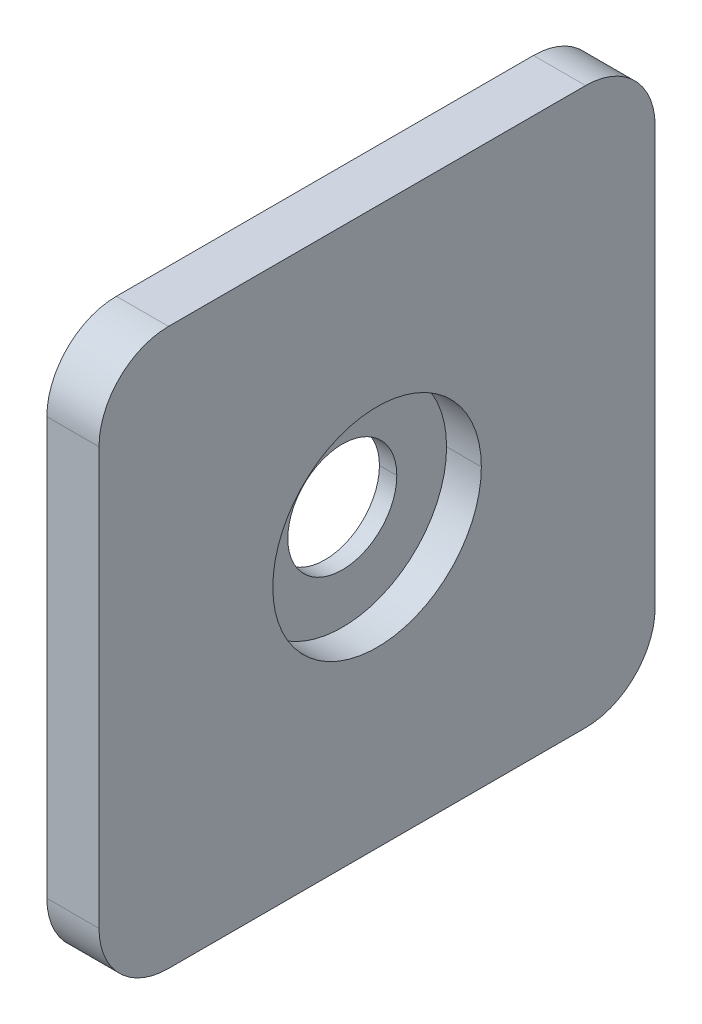
ISO-10303-21;
HEADER;
FILE_DESCRIPTION(('STEP AP214'),'2;1');
FILE_NAME('part.step','',(''),(''),'','','');
FILE_SCHEMA(('AUTOMOTIVE_DESIGN { 1 0 10303 214 1 1 1 1 }'));
ENDSEC;
DATA;
#1=APPLICATION_CONTEXT('core data for automotive mechanical design processes');
#2=APPLICATION_PROTOCOL_DEFINITION('international standard','automotive_design',2000,#1);
#3=PRODUCT_CONTEXT('',#1,'mechanical');
#4=PRODUCT('Part','Part','',(#3));
#5=PRODUCT_RELATED_PRODUCT_CATEGORY('part','',(#4));
#6=PRODUCT_DEFINITION_FORMATION('','',#4);
#7=PRODUCT_DEFINITION_CONTEXT('part definition',#1,'design');
#8=PRODUCT_DEFINITION('design','',#6,#7);
#9=PRODUCT_DEFINITION_SHAPE('','',#8);
#10=(LENGTH_UNIT() NAMED_UNIT(*) SI_UNIT(.MILLI.,.METRE.));
#11=(NAMED_UNIT(*) PLANE_ANGLE_UNIT() SI_UNIT($,.RADIAN.));
#12=(NAMED_UNIT(*) SI_UNIT($,.STERADIAN.) SOLID_ANGLE_UNIT());
#13=UNCERTAINTY_MEASURE_WITH_UNIT(LENGTH_MEASURE(1.E-05),#10,'distance_accuracy_value','');
#14=(GEOMETRIC_REPRESENTATION_CONTEXT(3) GLOBAL_UNCERTAINTY_ASSIGNED_CONTEXT((#13)) GLOBAL_UNIT_ASSIGNED_CONTEXT((#10,
#11,#12)) REPRESENTATION_CONTEXT('',''));
#15=CARTESIAN_POINT('',(0.,0.,0.));
#16=DIRECTION('',(0.,0.,1.));
#17=DIRECTION('',(1.,0.,0.));
#18=AXIS2_PLACEMENT_3D('',#15,#16,#17);
#19=CARTESIAN_POINT('',(-0.396875,0.,0.));
#20=DIRECTION('',(1.,0.,0.));
#21=DIRECTION('',(0.,0.,-1.));
#22=AXIS2_PLACEMENT_3D('',#19,#20,#21);
#23=CYLINDRICAL_SURFACE('',#22,4.7625);
#24=DIRECTION('',(1.,0.,0.));
#25=VECTOR('',#24,1.);
#26=CARTESIAN_POINT('',(-0.396875,0.,4.7625));
#27=LINE('',#26,#25);
#28=CARTESIAN_POINT('',(-0.396875,0.,4.7625));
#29=VERTEX_POINT('',#28);
#30=CARTESIAN_POINT('',(1.190625,0.,4.7625));
#31=VERTEX_POINT('',#30);
#32=EDGE_CURVE('E155',#29,#31,#27,.T.);
#33=ORIENTED_EDGE('',*,*,#32,.F.);
#34=CARTESIAN_POINT('',(-0.396875,0.,0.));
#35=DIRECTION('',(1.,0.,0.));
#36=DIRECTION('',(0.,0.,-1.));
#37=AXIS2_PLACEMENT_3D('',#34,#35,#36);
#38=CIRCLE('',#37,4.7625);
#39=CARTESIAN_POINT('',(-0.396875,0.,-4.7625));
#40=VERTEX_POINT('',#39);
#41=EDGE_CURVE('E11',#40,#29,#38,.T.);
#42=ORIENTED_EDGE('',*,*,#41,.F.);
#43=DIRECTION('',(1.,0.,0.));
#44=VECTOR('',#43,1.);
#45=CARTESIAN_POINT('',(-0.396875,0.,-4.7625));
#46=LINE('',#45,#44);
#47=CARTESIAN_POINT('',(1.190625,0.,-4.7625));
#48=VERTEX_POINT('',#47);
#49=EDGE_CURVE('E147',#40,#48,#46,.T.);
#50=ORIENTED_EDGE('',*,*,#49,.T.);
#51=CARTESIAN_POINT('',(1.190625,0.,0.));
#52=DIRECTION('',(1.,0.,0.));
#53=DIRECTION('',(0.,0.,-1.));
#54=AXIS2_PLACEMENT_3D('',#51,#52,#53);
#55=CIRCLE('',#54,4.7625);
#56=EDGE_CURVE('E136',#48,#31,#55,.T.);
#57=ORIENTED_EDGE('',*,*,#56,.T.);
#58=EDGE_LOOP('',(#33,#42,#50,#57));
#59=FACE_BOUND('',#58,.T.);
#60=ADVANCED_FACE('F17',(#59),#23,.F.);
#61=CARTESIAN_POINT('',(-0.396875,0.,0.));
#62=DIRECTION('',(1.,0.,0.));
#63=DIRECTION('',(0.,1.,0.));
#64=AXIS2_PLACEMENT_3D('',#61,#62,#63);
#65=PLANE('',#64);
#66=CARTESIAN_POINT('',(-0.396875,0.,0.));
#67=DIRECTION('',(-1.,0.,0.));
#68=DIRECTION('',(0.,0.,-1.));
#69=AXIS2_PLACEMENT_3D('',#66,#67,#68);
#70=CIRCLE('',#69,2.4892);
#71=CARTESIAN_POINT('',(-0.396875,0.,-2.4892));
#72=VERTEX_POINT('',#71);
#73=CARTESIAN_POINT('',(-0.396875,0.,2.4892));
#74=VERTEX_POINT('',#73);
#75=EDGE_CURVE('E175',#72,#74,#70,.T.);
#76=ORIENTED_EDGE('',*,*,#75,.T.);
#77=CARTESIAN_POINT('',(-0.396875,0.,0.));
#78=DIRECTION('',(-1.,0.,0.));
#79=DIRECTION('',(0.,0.,-1.));
#80=AXIS2_PLACEMENT_3D('',#77,#78,#79);
#81=CIRCLE('',#80,2.4892);
#82=EDGE_CURVE('E106',#74,#72,#81,.T.);
#83=ORIENTED_EDGE('',*,*,#82,.T.);
#84=EDGE_LOOP('',(#76,#83));
#85=FACE_BOUND('',#84,.T.);
#86=ORIENTED_EDGE('',*,*,#41,.T.);
#87=CARTESIAN_POINT('',(-0.396875,0.,0.));
#88=DIRECTION('',(1.,0.,0.));
#89=DIRECTION('',(0.,0.,-1.));
#90=AXIS2_PLACEMENT_3D('',#87,#88,#89);
#91=CIRCLE('',#90,4.7625);
#92=EDGE_CURVE('E162',#29,#40,#91,.T.);
#93=ORIENTED_EDGE('',*,*,#92,.T.);
#94=EDGE_LOOP('',(#86,#93));
#95=FACE_BOUND('',#94,.T.);
#96=ADVANCED_FACE('F469',(#85,#95),#65,.T.);
#97=CARTESIAN_POINT('',(1.190625,9.525,9.525));
#98=DIRECTION('',(-1.,0.,0.));
#99=DIRECTION('',(0.,0.,1.));
#100=AXIS2_PLACEMENT_3D('',#97,#98,#99);
#101=CYLINDRICAL_SURFACE('',#100,3.175);
#102=CARTESIAN_POINT('',(1.190625,9.525,9.525));
#103=DIRECTION('',(1.,0.,0.));
#104=DIRECTION('',(0.,0.,1.));
#105=AXIS2_PLACEMENT_3D('',#102,#103,#104);
#106=CIRCLE('',#105,3.175);
#107=CARTESIAN_POINT('',(1.190625,12.7,9.525));
#108=VERTEX_POINT('',#107);
#109=CARTESIAN_POINT('',(1.190625,9.525,12.7));
#110=VERTEX_POINT('',#109);
#111=EDGE_CURVE('E168',#108,#110,#106,.T.);
#112=ORIENTED_EDGE('',*,*,#111,.F.);
#113=DIRECTION('',(1.,0.,0.));
#114=VECTOR('',#113,1.);
#115=CARTESIAN_POINT('',(1.190625,12.7,9.525));
#116=LINE('',#115,#114);
#117=CARTESIAN_POINT('',(-1.190625,12.7,9.525));
#118=VERTEX_POINT('',#117);
#119=EDGE_CURVE('E182',#118,#108,#116,.T.);
#120=ORIENTED_EDGE('',*,*,#119,.F.);
#121=CARTESIAN_POINT('',(-1.190625,9.525,9.525));
#122=DIRECTION('',(-1.,0.,0.));
#123=DIRECTION('',(0.,0.,1.));
#124=AXIS2_PLACEMENT_3D('',#121,#122,#123);
#125=CIRCLE('',#124,3.175);
#126=CARTESIAN_POINT('',(-1.190625,9.525,12.7));
#127=VERTEX_POINT('',#126);
#128=EDGE_CURVE('E217',#127,#118,#125,.T.);
#129=ORIENTED_EDGE('',*,*,#128,.F.);
#130=DIRECTION('',(-1.,0.,0.));
#131=VECTOR('',#130,1.);
#132=CARTESIAN_POINT('',(1.190625,9.525,12.7));
#133=LINE('',#132,#131);
#134=EDGE_CURVE('E166',#110,#127,#133,.T.);
#135=ORIENTED_EDGE('',*,*,#134,.F.);
#136=EDGE_LOOP('',(#112,#120,#129,#135));
#137=FACE_BOUND('',#136,.T.);
#138=ADVANCED_FACE('F480',(#137),#101,.T.);
#139=CARTESIAN_POINT('',(1.190625,9.525,-9.525));
#140=DIRECTION('',(-1.,0.,0.));
#141=DIRECTION('',(0.,0.,1.));
#142=AXIS2_PLACEMENT_3D('',#139,#140,#141);
#143=CYLINDRICAL_SURFACE('',#142,3.175);
#144=CARTESIAN_POINT('',(1.190625,9.525,-9.525));
#145=DIRECTION('',(1.,0.,0.));
#146=DIRECTION('',(0.,0.,1.));
#147=AXIS2_PLACEMENT_3D('',#144,#145,#146);
#148=CIRCLE('',#147,3.175);
#149=CARTESIAN_POINT('',(1.190625,9.525,-12.7));
#150=VERTEX_POINT('',#149);
#151=CARTESIAN_POINT('',(1.190625,12.7,-9.525));
#152=VERTEX_POINT('',#151);
#153=EDGE_CURVE('E171',#150,#152,#148,.T.);
#154=ORIENTED_EDGE('',*,*,#153,.F.);
#155=DIRECTION('',(1.,0.,0.));
#156=VECTOR('',#155,1.);
#157=CARTESIAN_POINT('',(1.190625,9.525,-12.7));
#158=LINE('',#157,#156);
#159=CARTESIAN_POINT('',(-1.190625,9.525,-12.7));
#160=VERTEX_POINT('',#159);
#161=EDGE_CURVE('E203',#160,#150,#158,.T.);
#162=ORIENTED_EDGE('',*,*,#161,.F.);
#163=CARTESIAN_POINT('',(-1.190625,9.525,-9.525));
#164=DIRECTION('',(-1.,0.,0.));
#165=DIRECTION('',(0.,0.,1.));
#166=AXIS2_PLACEMENT_3D('',#163,#164,#165);
#167=CIRCLE('',#166,3.175);
#168=CARTESIAN_POINT('',(-1.190625,12.7,-9.525));
#169=VERTEX_POINT('',#168);
#170=EDGE_CURVE('E27',#169,#160,#167,.T.);
#171=ORIENTED_EDGE('',*,*,#170,.F.);
#172=DIRECTION('',(-1.,0.,0.));
#173=VECTOR('',#172,1.);
#174=CARTESIAN_POINT('',(1.190625,12.7,-9.525));
#175=LINE('',#174,#173);
#176=EDGE_CURVE('E213',#152,#169,#175,.T.);
#177=ORIENTED_EDGE('',*,*,#176,.F.);
#178=EDGE_LOOP('',(#154,#162,#171,#177));
#179=FACE_BOUND('',#178,.T.);
#180=ADVANCED_FACE('F286',(#179),#143,.T.);
#181=CARTESIAN_POINT('',(1.190625,-9.525,9.525));
#182=DIRECTION('',(-1.,0.,0.));
#183=DIRECTION('',(0.,0.,1.));
#184=AXIS2_PLACEMENT_3D('',#181,#182,#183);
#185=CYLINDRICAL_SURFACE('',#184,3.175);
#186=CARTESIAN_POINT('',(1.190625,-9.525,9.525));
#187=DIRECTION('',(1.,0.,0.));
#188=DIRECTION('',(0.,0.,1.));
#189=AXIS2_PLACEMENT_3D('',#186,#187,#188);
#190=CIRCLE('',#189,3.175);
#191=CARTESIAN_POINT('',(1.190625,-9.525,12.7));
#192=VERTEX_POINT('',#191);
#193=CARTESIAN_POINT('',(1.190625,-12.7,9.525));
#194=VERTEX_POINT('',#193);
#195=EDGE_CURVE('E41',#192,#194,#190,.T.);
#196=ORIENTED_EDGE('',*,*,#195,.F.);
#197=DIRECTION('',(1.,0.,0.));
#198=VECTOR('',#197,1.);
#199=CARTESIAN_POINT('',(1.190625,-9.525,12.7));
#200=LINE('',#199,#198);
#201=CARTESIAN_POINT('',(-1.190625,-9.525,12.7));
#202=VERTEX_POINT('',#201);
#203=EDGE_CURVE('E191',#202,#192,#200,.T.);
#204=ORIENTED_EDGE('',*,*,#203,.F.);
#205=CARTESIAN_POINT('',(-1.190625,-9.525,9.525));
#206=DIRECTION('',(-1.,0.,0.));
#207=DIRECTION('',(0.,0.,1.));
#208=AXIS2_PLACEMENT_3D('',#205,#206,#207);
#209=CIRCLE('',#208,3.175);
#210=CARTESIAN_POINT('',(-1.190625,-12.7,9.525));
#211=VERTEX_POINT('',#210);
#212=EDGE_CURVE('E219',#211,#202,#209,.T.);
#213=ORIENTED_EDGE('',*,*,#212,.F.);
#214=DIRECTION('',(-1.,0.,0.));
#215=VECTOR('',#214,1.);
#216=CARTESIAN_POINT('',(1.190625,-12.7,9.525));
#217=LINE('',#216,#215);
#218=EDGE_CURVE('E207',#194,#211,#217,.T.);
#219=ORIENTED_EDGE('',*,*,#218,.F.);
#220=EDGE_LOOP('',(#196,#204,#213,#219));
#221=FACE_BOUND('',#220,.T.);
#222=ADVANCED_FACE('F301',(#221),#185,.T.);
#223=CARTESIAN_POINT('',(1.190625,-9.525,-9.525));
#224=DIRECTION('',(-1.,0.,0.));
#225=DIRECTION('',(0.,0.,1.));
#226=AXIS2_PLACEMENT_3D('',#223,#224,#225);
#227=CYLINDRICAL_SURFACE('',#226,3.175);
#228=CARTESIAN_POINT('',(1.190625,-9.525,-9.525));
#229=DIRECTION('',(1.,0.,0.));
#230=DIRECTION('',(0.,0.,1.));
#231=AXIS2_PLACEMENT_3D('',#228,#229,#230);
#232=CIRCLE('',#231,3.175);
#233=CARTESIAN_POINT('',(1.190625,-12.7,-9.525));
#234=VERTEX_POINT('',#233);
#235=CARTESIAN_POINT('',(1.190625,-9.525,-12.7));
#236=VERTEX_POINT('',#235);
#237=EDGE_CURVE('E245',#234,#236,#232,.T.);
#238=ORIENTED_EDGE('',*,*,#237,.F.);
#239=DIRECTION('',(1.,0.,0.));
#240=VECTOR('',#239,1.);
#241=CARTESIAN_POINT('',(1.190625,-12.7,-9.525));
#242=LINE('',#241,#240);
#243=CARTESIAN_POINT('',(-1.190625,-12.7,-9.525));
#244=VERTEX_POINT('',#243);
#245=EDGE_CURVE('E208',#244,#234,#242,.T.);
#246=ORIENTED_EDGE('',*,*,#245,.F.);
#247=CARTESIAN_POINT('',(-1.190625,-9.525,-9.525));
#248=DIRECTION('',(-1.,0.,0.));
#249=DIRECTION('',(0.,0.,1.));
#250=AXIS2_PLACEMENT_3D('',#247,#248,#249);
#251=CIRCLE('',#250,3.175);
#252=CARTESIAN_POINT('',(-1.190625,-9.525,-12.7));
#253=VERTEX_POINT('',#252);
#254=EDGE_CURVE('E144',#253,#244,#251,.T.);
#255=ORIENTED_EDGE('',*,*,#254,.F.);
#256=DIRECTION('',(-1.,0.,0.));
#257=VECTOR('',#256,1.);
#258=CARTESIAN_POINT('',(1.190625,-9.525,-12.7));
#259=LINE('',#258,#257);
#260=EDGE_CURVE('E176',#236,#253,#259,.T.);
#261=ORIENTED_EDGE('',*,*,#260,.F.);
#262=EDGE_LOOP('',(#238,#246,#255,#261));
#263=FACE_BOUND('',#262,.T.);
#264=ADVANCED_FACE('F295',(#263),#227,.T.);
#265=CARTESIAN_POINT('',(-1.190625,0.,0.));
#266=DIRECTION('',(-1.,0.,0.));
#267=DIRECTION('',(0.,0.,1.));
#268=AXIS2_PLACEMENT_3D('',#265,#266,#267);
#269=PLANE('',#268);
#270=CARTESIAN_POINT('',(-1.190625,0.,0.));
#271=DIRECTION('',(1.,0.,0.));
#272=DIRECTION('',(0.,0.,-1.));
#273=AXIS2_PLACEMENT_3D('',#270,#271,#272);
#274=CIRCLE('',#273,2.4892);
#275=CARTESIAN_POINT('',(-1.190625,0.,-2.4892));
#276=VERTEX_POINT('',#275);
#277=CARTESIAN_POINT('',(-1.190625,0.,2.4892));
#278=VERTEX_POINT('',#277);
#279=EDGE_CURVE('E115',#276,#278,#274,.T.);
#280=ORIENTED_EDGE('',*,*,#279,.T.);
#281=CARTESIAN_POINT('',(-1.190625,0.,0.));
#282=DIRECTION('',(1.,0.,0.));
#283=DIRECTION('',(0.,0.,-1.));
#284=AXIS2_PLACEMENT_3D('',#281,#282,#283);
#285=CIRCLE('',#284,2.4892);
#286=EDGE_CURVE('E152',#278,#276,#285,.T.);
#287=ORIENTED_EDGE('',*,*,#286,.T.);
#288=EDGE_LOOP('',(#280,#287));
#289=FACE_BOUND('',#288,.T.);
#290=DIRECTION('',(0.,1.,0.));
#291=VECTOR('',#290,1.);
#292=CARTESIAN_POINT('',(-1.190625,-12.7,-12.7));
#293=LINE('',#292,#291);
#294=EDGE_CURVE('E180',#253,#160,#293,.T.);
#295=ORIENTED_EDGE('',*,*,#294,.F.);
#296=ORIENTED_EDGE('',*,*,#254,.T.);
#297=DIRECTION('',(0.,0.,-1.));
#298=VECTOR('',#297,1.);
#299=CARTESIAN_POINT('',(-1.190625,-12.7,12.7));
#300=LINE('',#299,#298);
#301=EDGE_CURVE('E241',#211,#244,#300,.T.);
#302=ORIENTED_EDGE('',*,*,#301,.F.);
#303=ORIENTED_EDGE('',*,*,#212,.T.);
#304=DIRECTION('',(0.,-1.,0.));
#305=VECTOR('',#304,1.);
#306=CARTESIAN_POINT('',(-1.190625,-12.7,12.7));
#307=LINE('',#306,#305);
#308=EDGE_CURVE('E186',#127,#202,#307,.T.);
#309=ORIENTED_EDGE('',*,*,#308,.F.);
#310=ORIENTED_EDGE('',*,*,#128,.T.);
#311=DIRECTION('',(0.,0.,1.));
#312=VECTOR('',#311,1.);
#313=CARTESIAN_POINT('',(-1.190625,12.7,12.7));
#314=LINE('',#313,#312);
#315=EDGE_CURVE('E187',#169,#118,#314,.T.);
#316=ORIENTED_EDGE('',*,*,#315,.F.);
#317=ORIENTED_EDGE('',*,*,#170,.T.);
#318=EDGE_LOOP('',(#295,#296,#302,#303,#309,#310,#316,#317));
#319=FACE_BOUND('',#318,.T.);
#320=ADVANCED_FACE('F279',(#289,#319),#269,.T.);
#321=CARTESIAN_POINT('',(1.190625,0.,0.));
#322=DIRECTION('',(-1.,0.,0.));
#323=DIRECTION('',(0.,0.,1.));
#324=AXIS2_PLACEMENT_3D('',#321,#322,#323);
#325=PLANE('',#324);
#326=ORIENTED_EDGE('',*,*,#56,.F.);
#327=CARTESIAN_POINT('',(1.190625,0.,0.));
#328=DIRECTION('',(1.,0.,0.));
#329=DIRECTION('',(0.,0.,-1.));
#330=AXIS2_PLACEMENT_3D('',#327,#328,#329);
#331=CIRCLE('',#330,4.7625);
#332=EDGE_CURVE('E139',#31,#48,#331,.T.);
#333=ORIENTED_EDGE('',*,*,#332,.F.);
#334=EDGE_LOOP('',(#326,#333));
#335=FACE_BOUND('',#334,.T.);
#336=DIRECTION('',(0.,0.,-1.));
#337=VECTOR('',#336,1.);
#338=CARTESIAN_POINT('',(1.190625,-12.7,12.7));
#339=LINE('',#338,#337);
#340=EDGE_CURVE('E204',#194,#234,#339,.T.);
#341=ORIENTED_EDGE('',*,*,#340,.T.);
#342=ORIENTED_EDGE('',*,*,#237,.T.);
#343=DIRECTION('',(0.,1.,0.));
#344=VECTOR('',#343,1.);
#345=CARTESIAN_POINT('',(1.190625,-12.7,-12.7));
#346=LINE('',#345,#344);
#347=EDGE_CURVE('E181',#236,#150,#346,.T.);
#348=ORIENTED_EDGE('',*,*,#347,.T.);
#349=ORIENTED_EDGE('',*,*,#153,.T.);
#350=DIRECTION('',(0.,0.,1.));
#351=VECTOR('',#350,1.);
#352=CARTESIAN_POINT('',(1.190625,12.7,12.7));
#353=LINE('',#352,#351);
#354=EDGE_CURVE('E216',#152,#108,#353,.T.);
#355=ORIENTED_EDGE('',*,*,#354,.T.);
#356=ORIENTED_EDGE('',*,*,#111,.T.);
#357=DIRECTION('',(0.,-1.,0.));
#358=VECTOR('',#357,1.);
#359=CARTESIAN_POINT('',(1.190625,-12.7,12.7));
#360=LINE('',#359,#358);
#361=EDGE_CURVE('E192',#110,#192,#360,.T.);
#362=ORIENTED_EDGE('',*,*,#361,.T.);
#363=ORIENTED_EDGE('',*,*,#195,.T.);
#364=EDGE_LOOP('',(#341,#342,#348,#349,#355,#356,#362,#363));
#365=FACE_BOUND('',#364,.T.);
#366=ADVANCED_FACE('F19',(#335,#365),#325,.F.);
#367=CARTESIAN_POINT('',(1.190625,-12.7,12.7));
#368=DIRECTION('',(0.,1.,0.));
#369=DIRECTION('',(1.,0.,0.));
#370=AXIS2_PLACEMENT_3D('',#367,#368,#369);
#371=PLANE('',#370);
#372=ORIENTED_EDGE('',*,*,#301,.T.);
#373=ORIENTED_EDGE('',*,*,#245,.T.);
#374=ORIENTED_EDGE('',*,*,#340,.F.);
#375=ORIENTED_EDGE('',*,*,#218,.T.);
#376=EDGE_LOOP('',(#372,#373,#374,#375));
#377=FACE_BOUND('',#376,.T.);
#378=ADVANCED_FACE('F298',(#377),#371,.F.);
#379=CARTESIAN_POINT('',(1.190625,-12.7,12.7));
#380=DIRECTION('',(0.,0.,-1.));
#381=DIRECTION('',(0.,-1.,0.));
#382=AXIS2_PLACEMENT_3D('',#379,#380,#381);
#383=PLANE('',#382);
#384=ORIENTED_EDGE('',*,*,#308,.T.);
#385=ORIENTED_EDGE('',*,*,#203,.T.);
#386=ORIENTED_EDGE('',*,*,#361,.F.);
#387=ORIENTED_EDGE('',*,*,#134,.T.);
#388=EDGE_LOOP('',(#384,#385,#386,#387));
#389=FACE_BOUND('',#388,.T.);
#390=ADVANCED_FACE('F305',(#389),#383,.F.);
#391=CARTESIAN_POINT('',(1.190625,12.7,12.7));
#392=DIRECTION('',(0.,-1.,0.));
#393=DIRECTION('',(0.,0.,-1.));
#394=AXIS2_PLACEMENT_3D('',#391,#392,#393);
#395=PLANE('',#394);
#396=ORIENTED_EDGE('',*,*,#354,.F.);
#397=ORIENTED_EDGE('',*,*,#176,.T.);
#398=ORIENTED_EDGE('',*,*,#315,.T.);
#399=ORIENTED_EDGE('',*,*,#119,.T.);
#400=EDGE_LOOP('',(#396,#397,#398,#399));
#401=FACE_BOUND('',#400,.T.);
#402=ADVANCED_FACE('F276',(#401),#395,.F.);
#403=CARTESIAN_POINT('',(1.190625,-12.7,-12.7));
#404=DIRECTION('',(0.,0.,1.));
#405=DIRECTION('',(1.,0.,0.));
#406=AXIS2_PLACEMENT_3D('',#403,#404,#405);
#407=PLANE('',#406);
#408=ORIENTED_EDGE('',*,*,#347,.F.);
#409=ORIENTED_EDGE('',*,*,#260,.T.);
#410=ORIENTED_EDGE('',*,*,#294,.T.);
#411=ORIENTED_EDGE('',*,*,#161,.T.);
#412=EDGE_LOOP('',(#408,#409,#410,#411));
#413=FACE_BOUND('',#412,.T.);
#414=ADVANCED_FACE('F290',(#413),#407,.F.);
#415=CARTESIAN_POINT('',(-1.190625,0.,0.));
#416=DIRECTION('',(1.,0.,0.));
#417=DIRECTION('',(0.,0.,-1.));
#418=AXIS2_PLACEMENT_3D('',#415,#416,#417);
#419=CYLINDRICAL_SURFACE('',#418,2.4892);
#420=DIRECTION('',(1.,0.,0.));
#421=VECTOR('',#420,1.);
#422=CARTESIAN_POINT('',(-1.190625,0.,2.4892));
#423=LINE('',#422,#421);
#424=EDGE_CURVE('E212',#278,#74,#423,.T.);
#425=ORIENTED_EDGE('',*,*,#424,.F.);
#426=ORIENTED_EDGE('',*,*,#279,.F.);
#427=DIRECTION('',(1.,0.,0.));
#428=VECTOR('',#427,1.);
#429=CARTESIAN_POINT('',(-1.190625,0.,-2.4892));
#430=LINE('',#429,#428);
#431=EDGE_CURVE('E172',#276,#72,#430,.T.);
#432=ORIENTED_EDGE('',*,*,#431,.T.);
#433=ORIENTED_EDGE('',*,*,#82,.F.);
#434=EDGE_LOOP('',(#425,#426,#432,#433));
#435=FACE_BOUND('',#434,.T.);
#436=ADVANCED_FACE('F541',(#435),#419,.F.);
#437=CARTESIAN_POINT('',(-1.190625,0.,0.));
#438=DIRECTION('',(1.,0.,0.));
#439=DIRECTION('',(0.,0.,-1.));
#440=AXIS2_PLACEMENT_3D('',#437,#438,#439);
#441=CYLINDRICAL_SURFACE('',#440,2.4892);
#442=ORIENTED_EDGE('',*,*,#286,.F.);
#443=ORIENTED_EDGE('',*,*,#424,.T.);
#444=ORIENTED_EDGE('',*,*,#75,.F.);
#445=ORIENTED_EDGE('',*,*,#431,.F.);
#446=EDGE_LOOP('',(#442,#443,#444,#445));
#447=FACE_BOUND('',#446,.T.);
#448=ADVANCED_FACE('F536',(#447),#441,.F.);
#449=CARTESIAN_POINT('',(-0.396875,0.,0.));
#450=DIRECTION('',(1.,0.,0.));
#451=DIRECTION('',(0.,0.,-1.));
#452=AXIS2_PLACEMENT_3D('',#449,#450,#451);
#453=CYLINDRICAL_SURFACE('',#452,4.7625);
#454=ORIENTED_EDGE('',*,*,#92,.F.);
#455=ORIENTED_EDGE('',*,*,#32,.T.);
#456=ORIENTED_EDGE('',*,*,#332,.T.);
#457=ORIENTED_EDGE('',*,*,#49,.F.);
#458=EDGE_LOOP('',(#454,#455,#456,#457));
#459=FACE_BOUND('',#458,.T.);
#460=ADVANCED_FACE('F154',(#459),#453,.F.);
#461=CLOSED_SHELL('',(#60,#96,#138,#180,#222,#264,#320,#366,#378,#390,#402,#414,#436,#448,#460));
#462=MANIFOLD_SOLID_BREP('B1',#461);
#463=ADVANCED_BREP_SHAPE_REPRESENTATION('',(#18,#462),#14);
#464=SHAPE_DEFINITION_REPRESENTATION(#9,#463);
ENDSEC;
END-ISO-10303-21;
